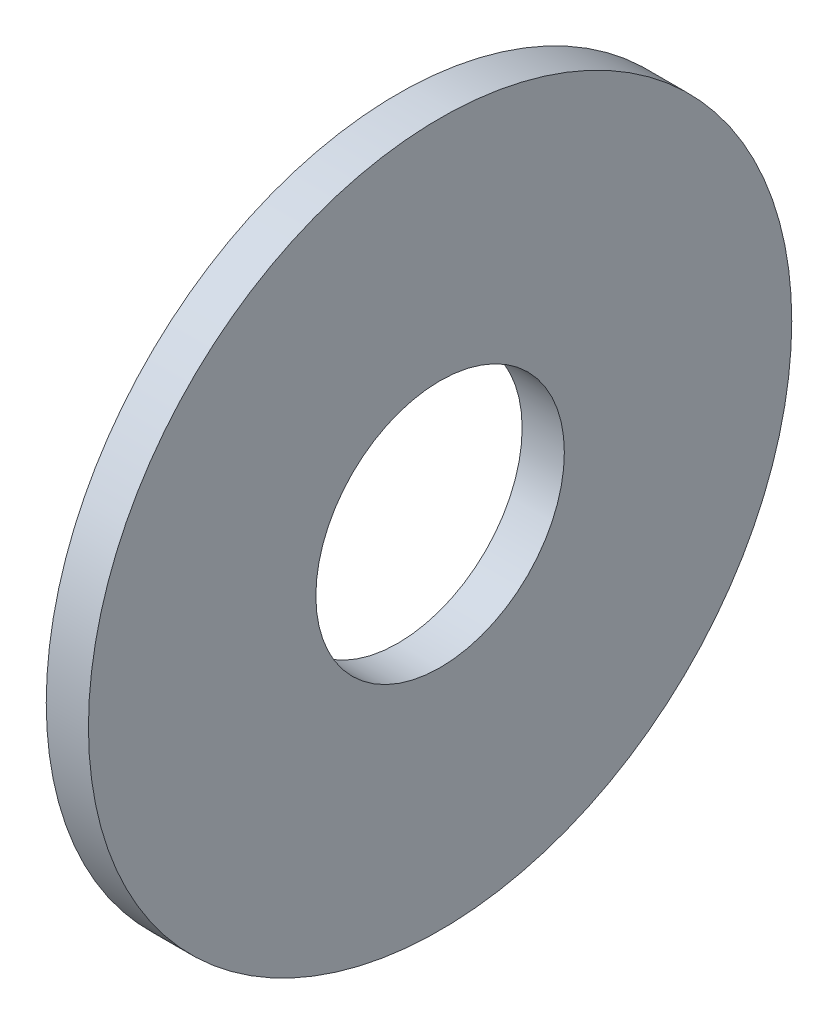
ISO-10303-21;
HEADER;
FILE_DESCRIPTION(('STEP AP214'),'2;1');
FILE_NAME('part.step','',(''),(''),'','','');
FILE_SCHEMA(('AUTOMOTIVE_DESIGN { 1 0 10303 214 1 1 1 1 }'));
ENDSEC;
DATA;
#1=APPLICATION_CONTEXT('core data for automotive mechanical design processes');
#2=APPLICATION_PROTOCOL_DEFINITION('international standard','automotive_design',2000,#1);
#3=PRODUCT_CONTEXT('',#1,'mechanical');
#4=PRODUCT('Part','Part','',(#3));
#5=PRODUCT_RELATED_PRODUCT_CATEGORY('part','',(#4));
#6=PRODUCT_DEFINITION_FORMATION('','',#4);
#7=PRODUCT_DEFINITION_CONTEXT('part definition',#1,'design');
#8=PRODUCT_DEFINITION('design','',#6,#7);
#9=PRODUCT_DEFINITION_SHAPE('','',#8);
#10=(LENGTH_UNIT() NAMED_UNIT(*) SI_UNIT(.MILLI.,.METRE.));
#11=(NAMED_UNIT(*) PLANE_ANGLE_UNIT() SI_UNIT($,.RADIAN.));
#12=(NAMED_UNIT(*) SI_UNIT($,.STERADIAN.) SOLID_ANGLE_UNIT());
#13=UNCERTAINTY_MEASURE_WITH_UNIT(LENGTH_MEASURE(1.E-05),#10,'distance_accuracy_value','');
#14=(GEOMETRIC_REPRESENTATION_CONTEXT(3) GLOBAL_UNCERTAINTY_ASSIGNED_CONTEXT((#13)) GLOBAL_UNIT_ASSIGNED_CONTEXT((#10,
#11,#12)) REPRESENTATION_CONTEXT('',''));
#15=CARTESIAN_POINT('',(0.,0.,0.));
#16=DIRECTION('',(0.,0.,1.));
#17=DIRECTION('',(1.,0.,0.));
#18=AXIS2_PLACEMENT_3D('',#15,#16,#17);
#19=CARTESIAN_POINT('',(1.143,0.,0.));
#20=DIRECTION('',(1.,0.,0.));
#21=DIRECTION('',(0.,0.,-1.));
#22=AXIS2_PLACEMENT_3D('',#19,#20,#21);
#23=PLANE('',#22);
#24=CARTESIAN_POINT('',(1.143,0.,0.));
#25=DIRECTION('',(1.,0.,0.));
#26=DIRECTION('',(0.,0.,-1.));
#27=AXIS2_PLACEMENT_3D('',#24,#25,#26);
#28=CIRCLE('',#27,9.525);
#29=CARTESIAN_POINT('',(1.143,0.,-9.525));
#30=VERTEX_POINT('',#29);
#31=EDGE_CURVE('E10',#30,#30,#28,.T.);
#32=ORIENTED_EDGE('',*,*,#31,.T.);
#33=EDGE_LOOP('',(#32));
#34=FACE_BOUND('',#33,.T.);
#35=CARTESIAN_POINT('',(1.143,0.,0.));
#36=DIRECTION('',(1.,0.,0.));
#37=DIRECTION('',(0.,0.,-1.));
#38=AXIS2_PLACEMENT_3D('',#35,#36,#37);
#39=CIRCLE('',#38,3.3655);
#40=CARTESIAN_POINT('',(1.143,0.,-3.3655));
#41=VERTEX_POINT('',#40);
#42=EDGE_CURVE('E41',#41,#41,#39,.T.);
#43=ORIENTED_EDGE('',*,*,#42,.F.);
#44=EDGE_LOOP('',(#43));
#45=FACE_BOUND('',#44,.T.);
#46=ADVANCED_FACE('F30',(#34,#45),#23,.T.);
#47=CARTESIAN_POINT('',(0.,0.,0.));
#48=DIRECTION('',(1.,0.,0.));
#49=DIRECTION('',(0.,0.,-1.));
#50=AXIS2_PLACEMENT_3D('',#47,#48,#49);
#51=PLANE('',#50);
#52=CARTESIAN_POINT('',(0.,0.,0.));
#53=DIRECTION('',(1.,0.,0.));
#54=DIRECTION('',(0.,0.,-1.));
#55=AXIS2_PLACEMENT_3D('',#52,#53,#54);
#56=CIRCLE('',#55,9.525);
#57=CARTESIAN_POINT('',(0.,0.,-9.525));
#58=VERTEX_POINT('',#57);
#59=EDGE_CURVE('E34',#58,#58,#56,.T.);
#60=ORIENTED_EDGE('',*,*,#59,.F.);
#61=EDGE_LOOP('',(#60));
#62=FACE_BOUND('',#61,.T.);
#63=CARTESIAN_POINT('',(0.,0.,0.));
#64=DIRECTION('',(1.,0.,0.));
#65=DIRECTION('',(0.,0.,-1.));
#66=AXIS2_PLACEMENT_3D('',#63,#64,#65);
#67=CIRCLE('',#66,3.3655);
#68=CARTESIAN_POINT('',(0.,0.,-3.3655));
#69=VERTEX_POINT('',#68);
#70=EDGE_CURVE('E43',#69,#69,#67,.T.);
#71=ORIENTED_EDGE('',*,*,#70,.T.);
#72=EDGE_LOOP('',(#71));
#73=FACE_BOUND('',#72,.T.);
#74=ADVANCED_FACE('F53',(#62,#73),#51,.F.);
#75=CARTESIAN_POINT('',(1.143,0.,0.));
#76=DIRECTION('',(-1.,0.,0.));
#77=DIRECTION('',(0.,0.,1.));
#78=AXIS2_PLACEMENT_3D('',#75,#76,#77);
#79=CYLINDRICAL_SURFACE('',#78,9.525);
#80=ORIENTED_EDGE('',*,*,#31,.F.);
#81=EDGE_LOOP('',(#80));
#82=FACE_BOUND('',#81,.T.);
#83=ORIENTED_EDGE('',*,*,#59,.T.);
#84=EDGE_LOOP('',(#83));
#85=FACE_BOUND('',#84,.T.);
#86=ADVANCED_FACE('F32',(#82,#85),#79,.T.);
#87=CARTESIAN_POINT('',(1.143,0.,0.));
#88=DIRECTION('',(-1.,0.,0.));
#89=DIRECTION('',(0.,0.,1.));
#90=AXIS2_PLACEMENT_3D('',#87,#88,#89);
#91=CYLINDRICAL_SURFACE('',#90,3.3655);
#92=ORIENTED_EDGE('',*,*,#42,.T.);
#93=EDGE_LOOP('',(#92));
#94=FACE_BOUND('',#93,.T.);
#95=ORIENTED_EDGE('',*,*,#70,.F.);
#96=EDGE_LOOP('',(#95));
#97=FACE_BOUND('',#96,.T.);
#98=ADVANCED_FACE('F49',(#94,#97),#91,.F.);
#99=CLOSED_SHELL('',(#46,#74,#86,#98));
#100=MANIFOLD_SOLID_BREP('B2',#99);
#101=ADVANCED_BREP_SHAPE_REPRESENTATION('',(#18,#100),#14);
#102=SHAPE_DEFINITION_REPRESENTATION(#9,#101);
ENDSEC;
END-ISO-10303-21;
